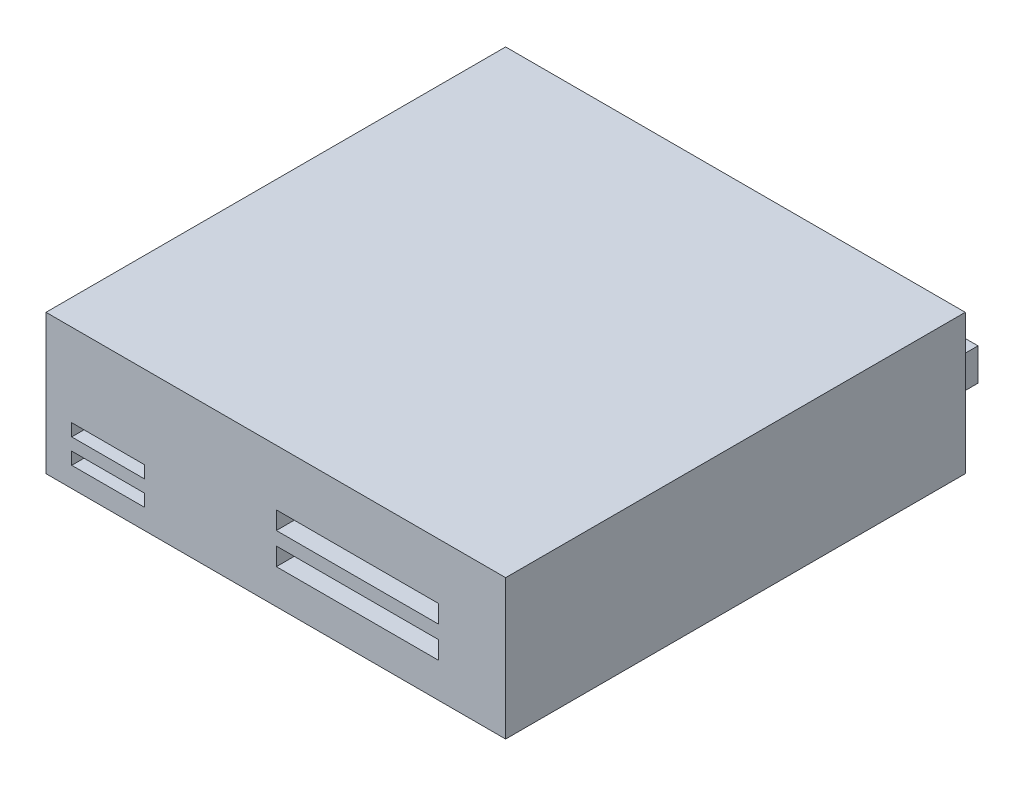
ISO-10303-21;
HEADER;
FILE_DESCRIPTION(('STEP AP214'),'2;1');
FILE_NAME('part.step','',(''),(''),'','','');
FILE_SCHEMA(('AUTOMOTIVE_DESIGN { 1 0 10303 214 1 1 1 1 }'));
ENDSEC;
DATA;
#1=APPLICATION_CONTEXT('core data for automotive mechanical design processes');
#2=APPLICATION_PROTOCOL_DEFINITION('international standard','automotive_design',2000,#1);
#3=PRODUCT_CONTEXT('',#1,'mechanical');
#4=PRODUCT('Part','Part','',(#3));
#5=PRODUCT_RELATED_PRODUCT_CATEGORY('part','',(#4));
#6=PRODUCT_DEFINITION_FORMATION('','',#4);
#7=PRODUCT_DEFINITION_CONTEXT('part definition',#1,'design');
#8=PRODUCT_DEFINITION('design','',#6,#7);
#9=PRODUCT_DEFINITION_SHAPE('','',#8);
#10=(LENGTH_UNIT() NAMED_UNIT(*) SI_UNIT(.MILLI.,.METRE.));
#11=(NAMED_UNIT(*) PLANE_ANGLE_UNIT() SI_UNIT($,.RADIAN.));
#12=(NAMED_UNIT(*) SI_UNIT($,.STERADIAN.) SOLID_ANGLE_UNIT());
#13=UNCERTAINTY_MEASURE_WITH_UNIT(LENGTH_MEASURE(1.E-05),#10,'distance_accuracy_value','');
#14=(GEOMETRIC_REPRESENTATION_CONTEXT(3) GLOBAL_UNCERTAINTY_ASSIGNED_CONTEXT((#13)) GLOBAL_UNIT_ASSIGNED_CONTEXT((#10,
#11,#12)) REPRESENTATION_CONTEXT('',''));
#15=CARTESIAN_POINT('',(0.,0.,0.));
#16=DIRECTION('',(0.,0.,1.));
#17=DIRECTION('',(1.,0.,0.));
#18=AXIS2_PLACEMENT_3D('',#15,#16,#17);
#19=CARTESIAN_POINT('',(-20.55,12.5,-20.55));
#20=DIRECTION('',(0.,0.,1.));
#21=DIRECTION('',(1.,0.,0.));
#22=AXIS2_PLACEMENT_3D('',#19,#20,#21);
#23=PLANE('',#22);
#24=DIRECTION('',(-1.,0.,0.));
#25=VECTOR('',#24,1.);
#26=CARTESIAN_POINT('',(-20.55,0.,-20.55));
#27=LINE('',#26,#25);
#28=CARTESIAN_POINT('',(20.55,0.,-20.55));
#29=VERTEX_POINT('',#28);
#30=CARTESIAN_POINT('',(-20.55,0.,-20.55));
#31=VERTEX_POINT('',#30);
#32=EDGE_CURVE('E456',#29,#31,#27,.T.);
#33=ORIENTED_EDGE('',*,*,#32,.T.);
#34=DIRECTION('',(0.,-1.,0.));
#35=VECTOR('',#34,1.);
#36=CARTESIAN_POINT('',(-20.55,12.5,-20.55));
#37=LINE('',#36,#35);
#38=CARTESIAN_POINT('',(-20.55,12.5,-20.55));
#39=VERTEX_POINT('',#38);
#40=EDGE_CURVE('E48',#39,#31,#37,.T.);
#41=ORIENTED_EDGE('',*,*,#40,.F.);
#42=DIRECTION('',(-1.,0.,0.));
#43=VECTOR('',#42,1.);
#44=CARTESIAN_POINT('',(-20.55,12.5,-20.55));
#45=LINE('',#44,#43);
#46=CARTESIAN_POINT('',(20.55,12.5,-20.55));
#47=VERTEX_POINT('',#46);
#48=EDGE_CURVE('E442',#47,#39,#45,.T.);
#49=ORIENTED_EDGE('',*,*,#48,.F.);
#50=DIRECTION('',(0.,-1.,0.));
#51=VECTOR('',#50,1.);
#52=CARTESIAN_POINT('',(20.55,12.5,-20.55));
#53=LINE('',#52,#51);
#54=EDGE_CURVE('E11',#47,#29,#53,.T.);
#55=ORIENTED_EDGE('',*,*,#54,.T.);
#56=EDGE_LOOP('',(#33,#41,#49,#55));
#57=FACE_BOUND('',#56,.T.);
#58=DIRECTION('',(0.,-1.,0.));
#59=VECTOR('',#58,1.);
#60=CARTESIAN_POINT('',(18.6891056004458,7.47226356728993,-20.55));
#61=LINE('',#60,#59);
#62=CARTESIAN_POINT('',(18.6891056004458,7.47226356728993,-20.55));
#63=VERTEX_POINT('',#62);
#64=CARTESIAN_POINT('',(18.6891056004458,4.57765461907273,-20.55));
#65=VERTEX_POINT('',#64);
#66=EDGE_CURVE('E260',#63,#65,#61,.T.);
#67=ORIENTED_EDGE('',*,*,#66,.F.);
#68=DIRECTION('',(1.,0.,0.));
#69=VECTOR('',#68,1.);
#70=CARTESIAN_POINT('',(18.6891056004458,7.47226356728993,-20.55));
#71=LINE('',#70,#69);
#72=CARTESIAN_POINT('',(10.3199101632091,7.47226356728993,-20.55));
#73=VERTEX_POINT('',#72);
#74=EDGE_CURVE('E257',#73,#63,#71,.T.);
#75=ORIENTED_EDGE('',*,*,#74,.F.);
#76=DIRECTION('',(0.,1.,0.));
#77=VECTOR('',#76,1.);
#78=CARTESIAN_POINT('',(10.3199101632091,7.47226356728993,-20.55));
#79=LINE('',#78,#77);
#80=CARTESIAN_POINT('',(10.3199101632091,4.57765461907273,-20.55));
#81=VERTEX_POINT('',#80);
#82=EDGE_CURVE('E66',#81,#73,#79,.T.);
#83=ORIENTED_EDGE('',*,*,#82,.F.);
#84=DIRECTION('',(-1.,0.,0.));
#85=VECTOR('',#84,1.);
#86=CARTESIAN_POINT('',(18.6891056004458,4.57765461907273,-20.55));
#87=LINE('',#86,#85);
#88=EDGE_CURVE('E58',#65,#81,#87,.T.);
#89=ORIENTED_EDGE('',*,*,#88,.F.);
#90=EDGE_LOOP('',(#67,#75,#83,#89));
#91=FACE_BOUND('',#90,.T.);
#92=ADVANCED_FACE('F39',(#57,#91),#23,.F.);
#93=CARTESIAN_POINT('',(20.55,12.5,20.55));
#94=DIRECTION('',(-1.,0.,0.));
#95=DIRECTION('',(0.,0.,1.));
#96=AXIS2_PLACEMENT_3D('',#93,#94,#95);
#97=PLANE('',#96);
#98=DIRECTION('',(0.,0.,-1.));
#99=VECTOR('',#98,1.);
#100=CARTESIAN_POINT('',(20.55,0.,20.55));
#101=LINE('',#100,#99);
#102=CARTESIAN_POINT('',(20.55,0.,20.55));
#103=VERTEX_POINT('',#102);
#104=EDGE_CURVE('E305',#103,#29,#101,.T.);
#105=ORIENTED_EDGE('',*,*,#104,.T.);
#106=ORIENTED_EDGE('',*,*,#54,.F.);
#107=DIRECTION('',(0.,0.,-1.));
#108=VECTOR('',#107,1.);
#109=CARTESIAN_POINT('',(20.55,12.5,20.55));
#110=LINE('',#109,#108);
#111=CARTESIAN_POINT('',(20.55,12.5,20.55));
#112=VERTEX_POINT('',#111);
#113=EDGE_CURVE('E438',#112,#47,#110,.T.);
#114=ORIENTED_EDGE('',*,*,#113,.F.);
#115=DIRECTION('',(0.,-1.,0.));
#116=VECTOR('',#115,1.);
#117=CARTESIAN_POINT('',(20.55,12.5,20.55));
#118=LINE('',#117,#116);
#119=EDGE_CURVE('E452',#112,#103,#118,.T.);
#120=ORIENTED_EDGE('',*,*,#119,.T.);
#121=EDGE_LOOP('',(#105,#106,#114,#120));
#122=FACE_BOUND('',#121,.T.);
#123=ADVANCED_FACE('F41',(#122),#97,.F.);
#124=CARTESIAN_POINT('',(-20.55,12.5,20.55));
#125=DIRECTION('',(1.,0.,0.));
#126=DIRECTION('',(0.,0.,-1.));
#127=AXIS2_PLACEMENT_3D('',#124,#125,#126);
#128=PLANE('',#127);
#129=DIRECTION('',(0.,0.,1.));
#130=VECTOR('',#129,1.);
#131=CARTESIAN_POINT('',(-20.55,0.,20.55));
#132=LINE('',#131,#130);
#133=CARTESIAN_POINT('',(-20.55,0.,20.55));
#134=VERTEX_POINT('',#133);
#135=EDGE_CURVE('E459',#31,#134,#132,.T.);
#136=ORIENTED_EDGE('',*,*,#135,.T.);
#137=DIRECTION('',(0.,-1.,0.));
#138=VECTOR('',#137,1.);
#139=CARTESIAN_POINT('',(-20.55,12.5,20.55));
#140=LINE('',#139,#138);
#141=CARTESIAN_POINT('',(-20.55,12.5,20.55));
#142=VERTEX_POINT('',#141);
#143=EDGE_CURVE('E466',#142,#134,#140,.T.);
#144=ORIENTED_EDGE('',*,*,#143,.F.);
#145=DIRECTION('',(0.,0.,1.));
#146=VECTOR('',#145,1.);
#147=CARTESIAN_POINT('',(-20.55,12.5,20.55));
#148=LINE('',#147,#146);
#149=EDGE_CURVE('E446',#39,#142,#148,.T.);
#150=ORIENTED_EDGE('',*,*,#149,.F.);
#151=ORIENTED_EDGE('',*,*,#40,.T.);
#152=EDGE_LOOP('',(#136,#144,#150,#151));
#153=FACE_BOUND('',#152,.T.);
#154=ADVANCED_FACE('F475',(#153),#128,.F.);
#155=CARTESIAN_POINT('',(-20.55,12.5,20.55));
#156=DIRECTION('',(0.,0.,-1.));
#157=DIRECTION('',(-1.,0.,0.));
#158=AXIS2_PLACEMENT_3D('',#155,#156,#157);
#159=PLANE('',#158);
#160=DIRECTION('',(1.,0.,0.));
#161=VECTOR('',#160,1.);
#162=CARTESIAN_POINT('',(0.0499999999999947,5.9,20.55));
#163=LINE('',#162,#161);
#164=CARTESIAN_POINT('',(0.0499999999999945,5.9,20.55));
#165=VERTEX_POINT('',#164);
#166=CARTESIAN_POINT('',(14.55,5.9,20.55));
#167=VERTEX_POINT('',#166);
#168=EDGE_CURVE('E293',#165,#167,#163,.T.);
#169=ORIENTED_EDGE('',*,*,#168,.F.);
#170=DIRECTION('',(0.,-1.,0.));
#171=VECTOR('',#170,1.);
#172=CARTESIAN_POINT('',(0.0499999999999945,7.5,20.55));
#173=LINE('',#172,#171);
#174=CARTESIAN_POINT('',(0.0499999999999945,7.5,20.55));
#175=VERTEX_POINT('',#174);
#176=EDGE_CURVE('E291',#175,#165,#173,.T.);
#177=ORIENTED_EDGE('',*,*,#176,.F.);
#178=DIRECTION('',(-1.,0.,0.));
#179=VECTOR('',#178,1.);
#180=CARTESIAN_POINT('',(0.0499999999999945,7.5,20.55));
#181=LINE('',#180,#179);
#182=CARTESIAN_POINT('',(14.55,7.5,20.55));
#183=VERTEX_POINT('',#182);
#184=EDGE_CURVE('E278',#183,#175,#181,.T.);
#185=ORIENTED_EDGE('',*,*,#184,.F.);
#186=DIRECTION('',(0.,1.,0.));
#187=VECTOR('',#186,1.);
#188=CARTESIAN_POINT('',(14.55,7.5,20.55));
#189=LINE('',#188,#187);
#190=EDGE_CURVE('E297',#167,#183,#189,.T.);
#191=ORIENTED_EDGE('',*,*,#190,.F.);
#192=EDGE_LOOP('',(#169,#177,#185,#191));
#193=FACE_BOUND('',#192,.T.);
#194=DIRECTION('',(1.,0.,0.));
#195=VECTOR('',#194,1.);
#196=CARTESIAN_POINT('',(0.049999999999995,3.1,20.55));
#197=LINE('',#196,#195);
#198=CARTESIAN_POINT('',(0.049999999999998,3.1,20.55));
#199=VERTEX_POINT('',#198);
#200=CARTESIAN_POINT('',(14.55,3.1,20.55));
#201=VERTEX_POINT('',#200);
#202=EDGE_CURVE('E335',#199,#201,#197,.T.);
#203=ORIENTED_EDGE('',*,*,#202,.F.);
#204=DIRECTION('',(0.,-1.,0.));
#205=VECTOR('',#204,1.);
#206=CARTESIAN_POINT('',(0.0499999999999948,4.7,20.55));
#207=LINE('',#206,#205);
#208=CARTESIAN_POINT('',(0.0499999999999948,4.7,20.55));
#209=VERTEX_POINT('',#208);
#210=EDGE_CURVE('E333',#209,#199,#207,.T.);
#211=ORIENTED_EDGE('',*,*,#210,.F.);
#212=DIRECTION('',(-1.,0.,0.));
#213=VECTOR('',#212,1.);
#214=CARTESIAN_POINT('',(0.0499999999999948,4.7,20.55));
#215=LINE('',#214,#213);
#216=CARTESIAN_POINT('',(14.55,4.7,20.55));
#217=VERTEX_POINT('',#216);
#218=EDGE_CURVE('E320',#217,#209,#215,.T.);
#219=ORIENTED_EDGE('',*,*,#218,.F.);
#220=DIRECTION('',(0.,1.,0.));
#221=VECTOR('',#220,1.);
#222=CARTESIAN_POINT('',(14.55,4.7,20.55));
#223=LINE('',#222,#221);
#224=EDGE_CURVE('E339',#201,#217,#223,.T.);
#225=ORIENTED_EDGE('',*,*,#224,.F.);
#226=EDGE_LOOP('',(#203,#211,#219,#225));
#227=FACE_BOUND('',#226,.T.);
#228=DIRECTION('',(1.,0.,0.));
#229=VECTOR('',#228,1.);
#230=CARTESIAN_POINT('',(-18.25,4.,20.55));
#231=LINE('',#230,#229);
#232=CARTESIAN_POINT('',(-18.25,4.,20.55));
#233=VERTEX_POINT('',#232);
#234=CARTESIAN_POINT('',(-11.75,4.,20.55));
#235=VERTEX_POINT('',#234);
#236=EDGE_CURVE('E376',#233,#235,#231,.T.);
#237=ORIENTED_EDGE('',*,*,#236,.F.);
#238=DIRECTION('',(0.,-1.,0.));
#239=VECTOR('',#238,1.);
#240=CARTESIAN_POINT('',(-18.25,5.1,20.55));
#241=LINE('',#240,#239);
#242=CARTESIAN_POINT('',(-18.25,5.1,20.55));
#243=VERTEX_POINT('',#242);
#244=EDGE_CURVE('E373',#243,#233,#241,.T.);
#245=ORIENTED_EDGE('',*,*,#244,.F.);
#246=DIRECTION('',(-1.,0.,0.));
#247=VECTOR('',#246,1.);
#248=CARTESIAN_POINT('',(-18.25,5.1,20.55));
#249=LINE('',#248,#247);
#250=CARTESIAN_POINT('',(-11.75,5.1,20.55));
#251=VERTEX_POINT('',#250);
#252=EDGE_CURVE('E360',#251,#243,#249,.T.);
#253=ORIENTED_EDGE('',*,*,#252,.F.);
#254=DIRECTION('',(0.,1.,0.));
#255=VECTOR('',#254,1.);
#256=CARTESIAN_POINT('',(-11.75,5.1,20.55));
#257=LINE('',#256,#255);
#258=EDGE_CURVE('E381',#235,#251,#257,.T.);
#259=ORIENTED_EDGE('',*,*,#258,.F.);
#260=EDGE_LOOP('',(#237,#245,#253,#259));
#261=FACE_BOUND('',#260,.T.);
#262=DIRECTION('',(1.,0.,0.));
#263=VECTOR('',#262,1.);
#264=CARTESIAN_POINT('',(-18.25,1.8,20.55));
#265=LINE('',#264,#263);
#266=CARTESIAN_POINT('',(-18.25,1.8,20.55));
#267=VERTEX_POINT('',#266);
#268=CARTESIAN_POINT('',(-11.75,1.8,20.55));
#269=VERTEX_POINT('',#268);
#270=EDGE_CURVE('E266',#267,#269,#265,.T.);
#271=ORIENTED_EDGE('',*,*,#270,.F.);
#272=DIRECTION('',(0.,-1.,0.));
#273=VECTOR('',#272,1.);
#274=CARTESIAN_POINT('',(-18.25,2.9,20.55));
#275=LINE('',#274,#273);
#276=CARTESIAN_POINT('',(-18.25,2.9,20.55));
#277=VERTEX_POINT('',#276);
#278=EDGE_CURVE('E262',#277,#267,#275,.T.);
#279=ORIENTED_EDGE('',*,*,#278,.F.);
#280=DIRECTION('',(-1.,0.,0.));
#281=VECTOR('',#280,1.);
#282=CARTESIAN_POINT('',(-18.25,2.9,20.55));
#283=LINE('',#282,#281);
#284=CARTESIAN_POINT('',(-11.75,2.9,20.55));
#285=VERTEX_POINT('',#284);
#286=EDGE_CURVE('E404',#285,#277,#283,.T.);
#287=ORIENTED_EDGE('',*,*,#286,.F.);
#288=DIRECTION('',(0.,1.,0.));
#289=VECTOR('',#288,1.);
#290=CARTESIAN_POINT('',(-11.75,2.9,20.55));
#291=LINE('',#290,#289);
#292=EDGE_CURVE('E420',#269,#285,#291,.T.);
#293=ORIENTED_EDGE('',*,*,#292,.F.);
#294=EDGE_LOOP('',(#271,#279,#287,#293));
#295=FACE_BOUND('',#294,.T.);
#296=DIRECTION('',(1.,0.,0.));
#297=VECTOR('',#296,1.);
#298=CARTESIAN_POINT('',(-20.55,0.,20.55));
#299=LINE('',#298,#297);
#300=EDGE_CURVE('E443',#134,#103,#299,.T.);
#301=ORIENTED_EDGE('',*,*,#300,.T.);
#302=ORIENTED_EDGE('',*,*,#119,.F.);
#303=DIRECTION('',(1.,0.,0.));
#304=VECTOR('',#303,1.);
#305=CARTESIAN_POINT('',(-20.55,12.5,20.55));
#306=LINE('',#305,#304);
#307=EDGE_CURVE('E449',#142,#112,#306,.T.);
#308=ORIENTED_EDGE('',*,*,#307,.F.);
#309=ORIENTED_EDGE('',*,*,#143,.T.);
#310=EDGE_LOOP('',(#301,#302,#308,#309));
#311=FACE_BOUND('',#310,.T.);
#312=ADVANCED_FACE('F484',(#193,#227,#261,#295,#311),#159,.F.);
#313=CARTESIAN_POINT('',(0.,12.5,0.));
#314=DIRECTION('',(0.,-1.,0.));
#315=DIRECTION('',(0.,0.,-1.));
#316=AXIS2_PLACEMENT_3D('',#313,#314,#315);
#317=PLANE('',#316);
#318=ORIENTED_EDGE('',*,*,#113,.T.);
#319=ORIENTED_EDGE('',*,*,#48,.T.);
#320=ORIENTED_EDGE('',*,*,#149,.T.);
#321=ORIENTED_EDGE('',*,*,#307,.T.);
#322=EDGE_LOOP('',(#318,#319,#320,#321));
#323=FACE_BOUND('',#322,.T.);
#324=ADVANCED_FACE('F490',(#323),#317,.F.);
#325=CARTESIAN_POINT('',(0.,0.,0.));
#326=DIRECTION('',(0.,-1.,0.));
#327=DIRECTION('',(0.,0.,-1.));
#328=AXIS2_PLACEMENT_3D('',#325,#326,#327);
#329=PLANE('',#328);
#330=ORIENTED_EDGE('',*,*,#104,.F.);
#331=ORIENTED_EDGE('',*,*,#300,.F.);
#332=ORIENTED_EDGE('',*,*,#135,.F.);
#333=ORIENTED_EDGE('',*,*,#32,.F.);
#334=EDGE_LOOP('',(#330,#331,#332,#333));
#335=FACE_BOUND('',#334,.T.);
#336=ADVANCED_FACE('F481',(#335),#329,.T.);
#337=CARTESIAN_POINT('',(-18.25,2.9,-9.44999999999999));
#338=DIRECTION('',(-1.,0.,0.));
#339=DIRECTION('',(0.,0.,1.));
#340=AXIS2_PLACEMENT_3D('',#337,#338,#339);
#341=PLANE('',#340);
#342=ORIENTED_EDGE('',*,*,#278,.T.);
#343=DIRECTION('',(0.,0.,1.));
#344=VECTOR('',#343,1.);
#345=CARTESIAN_POINT('',(-18.25,1.8,-9.44999999999999));
#346=LINE('',#345,#344);
#347=CARTESIAN_POINT('',(-18.25,1.8,-9.44999999999999));
#348=VERTEX_POINT('',#347);
#349=EDGE_CURVE('E415',#348,#267,#346,.T.);
#350=ORIENTED_EDGE('',*,*,#349,.F.);
#351=DIRECTION('',(0.,-1.,0.));
#352=VECTOR('',#351,1.);
#353=CARTESIAN_POINT('',(-18.25,2.9,-9.44999999999999));
#354=LINE('',#353,#352);
#355=CARTESIAN_POINT('',(-18.25,2.9,-9.44999999999999));
#356=VERTEX_POINT('',#355);
#357=EDGE_CURVE('E399',#356,#348,#354,.T.);
#358=ORIENTED_EDGE('',*,*,#357,.F.);
#359=DIRECTION('',(0.,0.,1.));
#360=VECTOR('',#359,1.);
#361=CARTESIAN_POINT('',(-18.25,2.9,-9.44999999999999));
#362=LINE('',#361,#360);
#363=EDGE_CURVE('E377',#356,#277,#362,.T.);
#364=ORIENTED_EDGE('',*,*,#363,.T.);
#365=EDGE_LOOP('',(#342,#350,#358,#364));
#366=FACE_BOUND('',#365,.T.);
#367=ADVANCED_FACE('F595',(#366),#341,.F.);
#368=CARTESIAN_POINT('',(-18.25,2.9,-9.44999999999999));
#369=DIRECTION('',(0.,1.,0.));
#370=DIRECTION('',(0.,0.,1.));
#371=AXIS2_PLACEMENT_3D('',#368,#369,#370);
#372=PLANE('',#371);
#373=ORIENTED_EDGE('',*,*,#286,.T.);
#374=ORIENTED_EDGE('',*,*,#363,.F.);
#375=DIRECTION('',(-1.,0.,0.));
#376=VECTOR('',#375,1.);
#377=CARTESIAN_POINT('',(-18.25,2.9,-9.44999999999999));
#378=LINE('',#377,#376);
#379=CARTESIAN_POINT('',(-11.75,2.9,-9.44999999999999));
#380=VERTEX_POINT('',#379);
#381=EDGE_CURVE('E412',#380,#356,#378,.T.);
#382=ORIENTED_EDGE('',*,*,#381,.F.);
#383=DIRECTION('',(0.,0.,1.));
#384=VECTOR('',#383,1.);
#385=CARTESIAN_POINT('',(-11.75,2.9,-9.44999999999999));
#386=LINE('',#385,#384);
#387=EDGE_CURVE('E429',#380,#285,#386,.T.);
#388=ORIENTED_EDGE('',*,*,#387,.T.);
#389=EDGE_LOOP('',(#373,#374,#382,#388));
#390=FACE_BOUND('',#389,.T.);
#391=ADVANCED_FACE('F591',(#390),#372,.F.);
#392=CARTESIAN_POINT('',(-11.75,2.9,-9.44999999999999));
#393=DIRECTION('',(1.,0.,0.));
#394=DIRECTION('',(0.,0.,-1.));
#395=AXIS2_PLACEMENT_3D('',#392,#393,#394);
#396=PLANE('',#395);
#397=ORIENTED_EDGE('',*,*,#292,.T.);
#398=ORIENTED_EDGE('',*,*,#387,.F.);
#399=DIRECTION('',(0.,1.,0.));
#400=VECTOR('',#399,1.);
#401=CARTESIAN_POINT('',(-11.75,2.9,-9.44999999999999));
#402=LINE('',#401,#400);
#403=CARTESIAN_POINT('',(-11.75,1.8,-9.44999999999999));
#404=VERTEX_POINT('',#403);
#405=EDGE_CURVE('E408',#404,#380,#402,.T.);
#406=ORIENTED_EDGE('',*,*,#405,.F.);
#407=DIRECTION('',(0.,0.,1.));
#408=VECTOR('',#407,1.);
#409=CARTESIAN_POINT('',(-11.75,1.8,-9.44999999999999));
#410=LINE('',#409,#408);
#411=EDGE_CURVE('E432',#404,#269,#410,.T.);
#412=ORIENTED_EDGE('',*,*,#411,.T.);
#413=EDGE_LOOP('',(#397,#398,#406,#412));
#414=FACE_BOUND('',#413,.T.);
#415=ADVANCED_FACE('F594',(#414),#396,.F.);
#416=CARTESIAN_POINT('',(-18.25,1.8,-9.44999999999999));
#417=DIRECTION('',(0.,-1.,0.));
#418=DIRECTION('',(0.,0.,-1.));
#419=AXIS2_PLACEMENT_3D('',#416,#417,#418);
#420=PLANE('',#419);
#421=ORIENTED_EDGE('',*,*,#270,.T.);
#422=ORIENTED_EDGE('',*,*,#411,.F.);
#423=DIRECTION('',(1.,0.,0.));
#424=VECTOR('',#423,1.);
#425=CARTESIAN_POINT('',(-18.25,1.8,-9.44999999999999));
#426=LINE('',#425,#424);
#427=EDGE_CURVE('E403',#348,#404,#426,.T.);
#428=ORIENTED_EDGE('',*,*,#427,.F.);
#429=ORIENTED_EDGE('',*,*,#349,.T.);
#430=EDGE_LOOP('',(#421,#422,#428,#429));
#431=FACE_BOUND('',#430,.T.);
#432=ADVANCED_FACE('F589',(#431),#420,.F.);
#433=CARTESIAN_POINT('',(0.,0.,-9.44999999999999));
#434=DIRECTION('',(0.,0.,1.));
#435=DIRECTION('',(1.,0.,0.));
#436=AXIS2_PLACEMENT_3D('',#433,#434,#435);
#437=PLANE('',#436);
#438=ORIENTED_EDGE('',*,*,#357,.T.);
#439=ORIENTED_EDGE('',*,*,#427,.T.);
#440=ORIENTED_EDGE('',*,*,#405,.T.);
#441=ORIENTED_EDGE('',*,*,#381,.T.);
#442=EDGE_LOOP('',(#438,#439,#440,#441));
#443=FACE_BOUND('',#442,.T.);
#444=ADVANCED_FACE('F585',(#443),#437,.T.);
#445=CARTESIAN_POINT('',(-18.25,5.1,-9.44999999999999));
#446=DIRECTION('',(-1.,0.,0.));
#447=DIRECTION('',(0.,0.,1.));
#448=AXIS2_PLACEMENT_3D('',#445,#446,#447);
#449=PLANE('',#448);
#450=ORIENTED_EDGE('',*,*,#244,.T.);
#451=DIRECTION('',(0.,0.,1.));
#452=VECTOR('',#451,1.);
#453=CARTESIAN_POINT('',(-18.25,4.,-9.44999999999999));
#454=LINE('',#453,#452);
#455=CARTESIAN_POINT('',(-18.25,4.,-9.44999999999999));
#456=VERTEX_POINT('',#455);
#457=EDGE_CURVE('E372',#456,#233,#454,.T.);
#458=ORIENTED_EDGE('',*,*,#457,.F.);
#459=DIRECTION('',(0.,-1.,0.));
#460=VECTOR('',#459,1.);
#461=CARTESIAN_POINT('',(-18.25,5.1,-9.44999999999999));
#462=LINE('',#461,#460);
#463=CARTESIAN_POINT('',(-18.25,5.1,-9.44999999999999));
#464=VERTEX_POINT('',#463);
#465=EDGE_CURVE('E355',#464,#456,#462,.T.);
#466=ORIENTED_EDGE('',*,*,#465,.F.);
#467=DIRECTION('',(0.,0.,1.));
#468=VECTOR('',#467,1.);
#469=CARTESIAN_POINT('',(-18.25,5.1,-9.44999999999999));
#470=LINE('',#469,#468);
#471=EDGE_CURVE('E336',#464,#243,#470,.T.);
#472=ORIENTED_EDGE('',*,*,#471,.T.);
#473=EDGE_LOOP('',(#450,#458,#466,#472));
#474=FACE_BOUND('',#473,.T.);
#475=ADVANCED_FACE('F575',(#474),#449,.F.);
#476=CARTESIAN_POINT('',(-18.25,5.1,-9.44999999999999));
#477=DIRECTION('',(0.,1.,0.));
#478=DIRECTION('',(0.,0.,1.));
#479=AXIS2_PLACEMENT_3D('',#476,#477,#478);
#480=PLANE('',#479);
#481=ORIENTED_EDGE('',*,*,#252,.T.);
#482=ORIENTED_EDGE('',*,*,#471,.F.);
#483=DIRECTION('',(-1.,0.,0.));
#484=VECTOR('',#483,1.);
#485=CARTESIAN_POINT('',(-18.25,5.1,-9.44999999999999));
#486=LINE('',#485,#484);
#487=CARTESIAN_POINT('',(-11.75,5.1,-9.44999999999999));
#488=VERTEX_POINT('',#487);
#489=EDGE_CURVE('E368',#488,#464,#486,.T.);
#490=ORIENTED_EDGE('',*,*,#489,.F.);
#491=DIRECTION('',(0.,0.,1.));
#492=VECTOR('',#491,1.);
#493=CARTESIAN_POINT('',(-11.75,5.1,-9.44999999999999));
#494=LINE('',#493,#492);
#495=EDGE_CURVE('E390',#488,#251,#494,.T.);
#496=ORIENTED_EDGE('',*,*,#495,.T.);
#497=EDGE_LOOP('',(#481,#482,#490,#496));
#498=FACE_BOUND('',#497,.T.);
#499=ADVANCED_FACE('F571',(#498),#480,.F.);
#500=CARTESIAN_POINT('',(-11.75,5.1,-9.44999999999999));
#501=DIRECTION('',(1.,0.,0.));
#502=DIRECTION('',(0.,0.,-1.));
#503=AXIS2_PLACEMENT_3D('',#500,#501,#502);
#504=PLANE('',#503);
#505=ORIENTED_EDGE('',*,*,#258,.T.);
#506=ORIENTED_EDGE('',*,*,#495,.F.);
#507=DIRECTION('',(0.,1.,0.));
#508=VECTOR('',#507,1.);
#509=CARTESIAN_POINT('',(-11.75,5.1,-9.44999999999999));
#510=LINE('',#509,#508);
#511=CARTESIAN_POINT('',(-11.75,4.,-9.44999999999999));
#512=VERTEX_POINT('',#511);
#513=EDGE_CURVE('E364',#512,#488,#510,.T.);
#514=ORIENTED_EDGE('',*,*,#513,.F.);
#515=DIRECTION('',(0.,0.,1.));
#516=VECTOR('',#515,1.);
#517=CARTESIAN_POINT('',(-11.75,4.,-9.44999999999999));
#518=LINE('',#517,#516);
#519=EDGE_CURVE('E393',#512,#235,#518,.T.);
#520=ORIENTED_EDGE('',*,*,#519,.T.);
#521=EDGE_LOOP('',(#505,#506,#514,#520));
#522=FACE_BOUND('',#521,.T.);
#523=ADVANCED_FACE('F574',(#522),#504,.F.);
#524=CARTESIAN_POINT('',(-18.25,4.,-9.44999999999999));
#525=DIRECTION('',(0.,-1.,0.));
#526=DIRECTION('',(0.,0.,-1.));
#527=AXIS2_PLACEMENT_3D('',#524,#525,#526);
#528=PLANE('',#527);
#529=ORIENTED_EDGE('',*,*,#236,.T.);
#530=ORIENTED_EDGE('',*,*,#519,.F.);
#531=DIRECTION('',(1.,0.,0.));
#532=VECTOR('',#531,1.);
#533=CARTESIAN_POINT('',(-18.25,4.,-9.44999999999999));
#534=LINE('',#533,#532);
#535=EDGE_CURVE('E359',#456,#512,#534,.T.);
#536=ORIENTED_EDGE('',*,*,#535,.F.);
#537=ORIENTED_EDGE('',*,*,#457,.T.);
#538=EDGE_LOOP('',(#529,#530,#536,#537));
#539=FACE_BOUND('',#538,.T.);
#540=ADVANCED_FACE('F569',(#539),#528,.F.);
#541=CARTESIAN_POINT('',(0.,0.,-9.44999999999999));
#542=DIRECTION('',(0.,0.,1.));
#543=DIRECTION('',(1.,0.,0.));
#544=AXIS2_PLACEMENT_3D('',#541,#542,#543);
#545=PLANE('',#544);
#546=ORIENTED_EDGE('',*,*,#465,.T.);
#547=ORIENTED_EDGE('',*,*,#535,.T.);
#548=ORIENTED_EDGE('',*,*,#513,.T.);
#549=ORIENTED_EDGE('',*,*,#489,.T.);
#550=EDGE_LOOP('',(#546,#547,#548,#549));
#551=FACE_BOUND('',#550,.T.);
#552=ADVANCED_FACE('F565',(#551),#545,.T.);
#553=CARTESIAN_POINT('',(0.0499999999999948,4.7,-9.44999999999999));
#554=DIRECTION('',(-1.,0.,0.));
#555=DIRECTION('',(0.,-1.,0.));
#556=AXIS2_PLACEMENT_3D('',#553,#554,#555);
#557=PLANE('',#556);
#558=ORIENTED_EDGE('',*,*,#210,.T.);
#559=DIRECTION('',(0.,0.,1.));
#560=VECTOR('',#559,1.);
#561=CARTESIAN_POINT('',(0.049999999999995,3.1,-9.44999999999999));
#562=LINE('',#561,#560);
#563=CARTESIAN_POINT('',(0.049999999999995,3.1,-9.44999999999999));
#564=VERTEX_POINT('',#563);
#565=EDGE_CURVE('E332',#564,#199,#562,.T.);
#566=ORIENTED_EDGE('',*,*,#565,.F.);
#567=DIRECTION('',(0.,-1.,0.));
#568=VECTOR('',#567,1.);
#569=CARTESIAN_POINT('',(0.0499999999999948,4.7,-9.44999999999999));
#570=LINE('',#569,#568);
#571=CARTESIAN_POINT('',(0.0499999999999948,4.7,-9.44999999999999));
#572=VERTEX_POINT('',#571);
#573=EDGE_CURVE('E315',#572,#564,#570,.T.);
#574=ORIENTED_EDGE('',*,*,#573,.F.);
#575=DIRECTION('',(0.,0.,1.));
#576=VECTOR('',#575,1.);
#577=CARTESIAN_POINT('',(0.0499999999999948,4.7,-9.44999999999999));
#578=LINE('',#577,#576);
#579=EDGE_CURVE('E294',#572,#209,#578,.T.);
#580=ORIENTED_EDGE('',*,*,#579,.T.);
#581=EDGE_LOOP('',(#558,#566,#574,#580));
#582=FACE_BOUND('',#581,.T.);
#583=ADVANCED_FACE('F555',(#582),#557,.F.);
#584=CARTESIAN_POINT('',(0.0499999999999948,4.7,-9.44999999999999));
#585=DIRECTION('',(0.,1.,0.));
#586=DIRECTION('',(0.,0.,1.));
#587=AXIS2_PLACEMENT_3D('',#584,#585,#586);
#588=PLANE('',#587);
#589=ORIENTED_EDGE('',*,*,#218,.T.);
#590=ORIENTED_EDGE('',*,*,#579,.F.);
#591=DIRECTION('',(-1.,0.,0.));
#592=VECTOR('',#591,1.);
#593=CARTESIAN_POINT('',(0.0499999999999948,4.7,-9.44999999999999));
#594=LINE('',#593,#592);
#595=CARTESIAN_POINT('',(14.55,4.7,-9.44999999999999));
#596=VERTEX_POINT('',#595);
#597=EDGE_CURVE('E328',#596,#572,#594,.T.);
#598=ORIENTED_EDGE('',*,*,#597,.F.);
#599=DIRECTION('',(0.,0.,1.));
#600=VECTOR('',#599,1.);
#601=CARTESIAN_POINT('',(14.55,4.7,-9.44999999999999));
#602=LINE('',#601,#600);
#603=EDGE_CURVE('E346',#596,#217,#602,.T.);
#604=ORIENTED_EDGE('',*,*,#603,.T.);
#605=EDGE_LOOP('',(#589,#590,#598,#604));
#606=FACE_BOUND('',#605,.T.);
#607=ADVANCED_FACE('F551',(#606),#588,.F.);
#608=CARTESIAN_POINT('',(14.55,4.7,-9.44999999999999));
#609=DIRECTION('',(1.,0.,0.));
#610=DIRECTION('',(0.,0.,-1.));
#611=AXIS2_PLACEMENT_3D('',#608,#609,#610);
#612=PLANE('',#611);
#613=ORIENTED_EDGE('',*,*,#224,.T.);
#614=ORIENTED_EDGE('',*,*,#603,.F.);
#615=DIRECTION('',(0.,1.,0.));
#616=VECTOR('',#615,1.);
#617=CARTESIAN_POINT('',(14.55,4.7,-9.44999999999999));
#618=LINE('',#617,#616);
#619=CARTESIAN_POINT('',(14.55,3.1,-9.44999999999999));
#620=VERTEX_POINT('',#619);
#621=EDGE_CURVE('E324',#620,#596,#618,.T.);
#622=ORIENTED_EDGE('',*,*,#621,.F.);
#623=DIRECTION('',(0.,0.,1.));
#624=VECTOR('',#623,1.);
#625=CARTESIAN_POINT('',(14.55,3.1,-9.44999999999999));
#626=LINE('',#625,#624);
#627=EDGE_CURVE('E349',#620,#201,#626,.T.);
#628=ORIENTED_EDGE('',*,*,#627,.T.);
#629=EDGE_LOOP('',(#613,#614,#622,#628));
#630=FACE_BOUND('',#629,.T.);
#631=ADVANCED_FACE('F554',(#630),#612,.F.);
#632=CARTESIAN_POINT('',(0.049999999999995,3.1,-9.44999999999999));
#633=DIRECTION('',(0.,-1.,0.));
#634=DIRECTION('',(0.,0.,-1.));
#635=AXIS2_PLACEMENT_3D('',#632,#633,#634);
#636=PLANE('',#635);
#637=ORIENTED_EDGE('',*,*,#202,.T.);
#638=ORIENTED_EDGE('',*,*,#627,.F.);
#639=DIRECTION('',(1.,0.,0.));
#640=VECTOR('',#639,1.);
#641=CARTESIAN_POINT('',(0.049999999999995,3.1,-9.44999999999999));
#642=LINE('',#641,#640);
#643=EDGE_CURVE('E319',#564,#620,#642,.T.);
#644=ORIENTED_EDGE('',*,*,#643,.F.);
#645=ORIENTED_EDGE('',*,*,#565,.T.);
#646=EDGE_LOOP('',(#637,#638,#644,#645));
#647=FACE_BOUND('',#646,.T.);
#648=ADVANCED_FACE('F549',(#647),#636,.F.);
#649=CARTESIAN_POINT('',(0.,0.,-9.44999999999999));
#650=DIRECTION('',(0.,0.,1.));
#651=DIRECTION('',(1.,0.,0.));
#652=AXIS2_PLACEMENT_3D('',#649,#650,#651);
#653=PLANE('',#652);
#654=ORIENTED_EDGE('',*,*,#573,.T.);
#655=ORIENTED_EDGE('',*,*,#643,.T.);
#656=ORIENTED_EDGE('',*,*,#621,.T.);
#657=ORIENTED_EDGE('',*,*,#597,.T.);
#658=EDGE_LOOP('',(#654,#655,#656,#657));
#659=FACE_BOUND('',#658,.T.);
#660=ADVANCED_FACE('F545',(#659),#653,.T.);
#661=CARTESIAN_POINT('',(0.0499999999999945,7.5,-9.44999999999999));
#662=DIRECTION('',(-1.,0.,0.));
#663=DIRECTION('',(0.,-1.,0.));
#664=AXIS2_PLACEMENT_3D('',#661,#662,#663);
#665=PLANE('',#664);
#666=ORIENTED_EDGE('',*,*,#176,.T.);
#667=DIRECTION('',(0.,0.,1.));
#668=VECTOR('',#667,1.);
#669=CARTESIAN_POINT('',(0.0499999999999947,5.9,-9.44999999999999));
#670=LINE('',#669,#668);
#671=CARTESIAN_POINT('',(0.0499999999999947,5.9,-9.44999999999999));
#672=VERTEX_POINT('',#671);
#673=EDGE_CURVE('E290',#672,#165,#670,.T.);
#674=ORIENTED_EDGE('',*,*,#673,.F.);
#675=DIRECTION('',(0.,-1.,0.));
#676=VECTOR('',#675,1.);
#677=CARTESIAN_POINT('',(0.0499999999999945,7.5,-9.44999999999999));
#678=LINE('',#677,#676);
#679=CARTESIAN_POINT('',(0.0499999999999945,7.5,-9.44999999999999));
#680=VERTEX_POINT('',#679);
#681=EDGE_CURVE('E273',#680,#672,#678,.T.);
#682=ORIENTED_EDGE('',*,*,#681,.F.);
#683=DIRECTION('',(0.,0.,1.));
#684=VECTOR('',#683,1.);
#685=CARTESIAN_POINT('',(0.0499999999999945,7.5,-9.44999999999999));
#686=LINE('',#685,#684);
#687=EDGE_CURVE('E302',#680,#175,#686,.T.);
#688=ORIENTED_EDGE('',*,*,#687,.T.);
#689=EDGE_LOOP('',(#666,#674,#682,#688));
#690=FACE_BOUND('',#689,.T.);
#691=ADVANCED_FACE('F535',(#690),#665,.F.);
#692=CARTESIAN_POINT('',(0.0499999999999945,7.5,-9.44999999999999));
#693=DIRECTION('',(0.,1.,0.));
#694=DIRECTION('',(0.,0.,1.));
#695=AXIS2_PLACEMENT_3D('',#692,#693,#694);
#696=PLANE('',#695);
#697=ORIENTED_EDGE('',*,*,#184,.T.);
#698=ORIENTED_EDGE('',*,*,#687,.F.);
#699=DIRECTION('',(-1.,0.,0.));
#700=VECTOR('',#699,1.);
#701=CARTESIAN_POINT('',(0.0499999999999945,7.5,-9.44999999999999));
#702=LINE('',#701,#700);
#703=CARTESIAN_POINT('',(14.55,7.5,-9.44999999999999));
#704=VERTEX_POINT('',#703);
#705=EDGE_CURVE('E286',#704,#680,#702,.T.);
#706=ORIENTED_EDGE('',*,*,#705,.F.);
#707=DIRECTION('',(0.,0.,1.));
#708=VECTOR('',#707,1.);
#709=CARTESIAN_POINT('',(14.55,7.5,-9.44999999999999));
#710=LINE('',#709,#708);
#711=EDGE_CURVE('E306',#704,#183,#710,.T.);
#712=ORIENTED_EDGE('',*,*,#711,.T.);
#713=EDGE_LOOP('',(#697,#698,#706,#712));
#714=FACE_BOUND('',#713,.T.);
#715=ADVANCED_FACE('F531',(#714),#696,.F.);
#716=CARTESIAN_POINT('',(14.55,7.5,-9.44999999999999));
#717=DIRECTION('',(1.,0.,0.));
#718=DIRECTION('',(0.,0.,-1.));
#719=AXIS2_PLACEMENT_3D('',#716,#717,#718);
#720=PLANE('',#719);
#721=ORIENTED_EDGE('',*,*,#190,.T.);
#722=ORIENTED_EDGE('',*,*,#711,.F.);
#723=DIRECTION('',(0.,1.,0.));
#724=VECTOR('',#723,1.);
#725=CARTESIAN_POINT('',(14.55,7.5,-9.44999999999999));
#726=LINE('',#725,#724);
#727=CARTESIAN_POINT('',(14.55,5.9,-9.44999999999999));
#728=VERTEX_POINT('',#727);
#729=EDGE_CURVE('E282',#728,#704,#726,.T.);
#730=ORIENTED_EDGE('',*,*,#729,.F.);
#731=DIRECTION('',(0.,0.,1.));
#732=VECTOR('',#731,1.);
#733=CARTESIAN_POINT('',(14.55,5.9,-9.44999999999999));
#734=LINE('',#733,#732);
#735=EDGE_CURVE('E309',#728,#167,#734,.T.);
#736=ORIENTED_EDGE('',*,*,#735,.T.);
#737=EDGE_LOOP('',(#721,#722,#730,#736));
#738=FACE_BOUND('',#737,.T.);
#739=ADVANCED_FACE('F534',(#738),#720,.F.);
#740=CARTESIAN_POINT('',(0.0499999999999947,5.9,-9.44999999999999));
#741=DIRECTION('',(0.,-1.,0.));
#742=DIRECTION('',(0.,0.,-1.));
#743=AXIS2_PLACEMENT_3D('',#740,#741,#742);
#744=PLANE('',#743);
#745=ORIENTED_EDGE('',*,*,#168,.T.);
#746=ORIENTED_EDGE('',*,*,#735,.F.);
#747=DIRECTION('',(1.,0.,0.));
#748=VECTOR('',#747,1.);
#749=CARTESIAN_POINT('',(0.0499999999999947,5.9,-9.44999999999999));
#750=LINE('',#749,#748);
#751=EDGE_CURVE('E277',#672,#728,#750,.T.);
#752=ORIENTED_EDGE('',*,*,#751,.F.);
#753=ORIENTED_EDGE('',*,*,#673,.T.);
#754=EDGE_LOOP('',(#745,#746,#752,#753));
#755=FACE_BOUND('',#754,.T.);
#756=ADVANCED_FACE('F529',(#755),#744,.F.);
#757=CARTESIAN_POINT('',(0.,0.,-9.44999999999999));
#758=DIRECTION('',(0.,0.,1.));
#759=DIRECTION('',(1.,0.,0.));
#760=AXIS2_PLACEMENT_3D('',#757,#758,#759);
#761=PLANE('',#760);
#762=ORIENTED_EDGE('',*,*,#681,.T.);
#763=ORIENTED_EDGE('',*,*,#751,.T.);
#764=ORIENTED_EDGE('',*,*,#729,.T.);
#765=ORIENTED_EDGE('',*,*,#705,.T.);
#766=EDGE_LOOP('',(#762,#763,#764,#765));
#767=FACE_BOUND('',#766,.T.);
#768=ADVANCED_FACE('F526',(#767),#761,.T.);
#769=CARTESIAN_POINT('',(18.6891056004458,7.47226356728993,-23.55));
#770=DIRECTION('',(-1.,0.,0.));
#771=DIRECTION('',(0.,0.,1.));
#772=AXIS2_PLACEMENT_3D('',#769,#770,#771);
#773=PLANE('',#772);
#774=ORIENTED_EDGE('',*,*,#66,.T.);
#775=DIRECTION('',(0.,0.,1.));
#776=VECTOR('',#775,1.);
#777=CARTESIAN_POINT('',(18.6891056004458,4.57765461907273,-23.55));
#778=LINE('',#777,#776);
#779=CARTESIAN_POINT('',(18.6891056004458,4.57765461907273,-23.55));
#780=VERTEX_POINT('',#779);
#781=EDGE_CURVE('E239',#780,#65,#778,.T.);
#782=ORIENTED_EDGE('',*,*,#781,.F.);
#783=DIRECTION('',(0.,-1.,0.));
#784=VECTOR('',#783,1.);
#785=CARTESIAN_POINT('',(18.6891056004458,7.47226356728993,-23.55));
#786=LINE('',#785,#784);
#787=CARTESIAN_POINT('',(18.6891056004458,7.47226356728993,-23.55));
#788=VERTEX_POINT('',#787);
#789=EDGE_CURVE('E247',#788,#780,#786,.T.);
#790=ORIENTED_EDGE('',*,*,#789,.F.);
#791=DIRECTION('',(0.,0.,1.));
#792=VECTOR('',#791,1.);
#793=CARTESIAN_POINT('',(18.6891056004458,7.47226356728993,-23.55));
#794=LINE('',#793,#792);
#795=EDGE_CURVE('E498',#788,#63,#794,.T.);
#796=ORIENTED_EDGE('',*,*,#795,.T.);
#797=EDGE_LOOP('',(#774,#782,#790,#796));
#798=FACE_BOUND('',#797,.T.);
#799=ADVANCED_FACE('F259',(#798),#773,.F.);
#800=CARTESIAN_POINT('',(18.6891056004458,4.57765461907273,-23.55));
#801=DIRECTION('',(0.,1.,0.));
#802=DIRECTION('',(0.,0.,1.));
#803=AXIS2_PLACEMENT_3D('',#800,#801,#802);
#804=PLANE('',#803);
#805=ORIENTED_EDGE('',*,*,#88,.T.);
#806=DIRECTION('',(0.,0.,1.));
#807=VECTOR('',#806,1.);
#808=CARTESIAN_POINT('',(10.3199101632091,4.57765461907273,-23.55));
#809=LINE('',#808,#807);
#810=CARTESIAN_POINT('',(10.3199101632091,4.57765461907273,-23.55));
#811=VERTEX_POINT('',#810);
#812=EDGE_CURVE('E242',#811,#81,#809,.T.);
#813=ORIENTED_EDGE('',*,*,#812,.F.);
#814=DIRECTION('',(-1.,0.,0.));
#815=VECTOR('',#814,1.);
#816=CARTESIAN_POINT('',(18.6891056004458,4.57765461907273,-23.55));
#817=LINE('',#816,#815);
#818=EDGE_CURVE('E235',#780,#811,#817,.T.);
#819=ORIENTED_EDGE('',*,*,#818,.F.);
#820=ORIENTED_EDGE('',*,*,#781,.T.);
#821=EDGE_LOOP('',(#805,#813,#819,#820));
#822=FACE_BOUND('',#821,.T.);
#823=ADVANCED_FACE('F237',(#822),#804,.F.);
#824=CARTESIAN_POINT('',(10.3199101632091,7.47226356728993,-23.55));
#825=DIRECTION('',(1.,0.,0.));
#826=DIRECTION('',(0.,0.,-1.));
#827=AXIS2_PLACEMENT_3D('',#824,#825,#826);
#828=PLANE('',#827);
#829=ORIENTED_EDGE('',*,*,#82,.T.);
#830=DIRECTION('',(0.,0.,1.));
#831=VECTOR('',#830,1.);
#832=CARTESIAN_POINT('',(10.3199101632091,7.47226356728993,-23.55));
#833=LINE('',#832,#831);
#834=CARTESIAN_POINT('',(10.3199101632091,7.47226356728993,-23.55));
#835=VERTEX_POINT('',#834);
#836=EDGE_CURVE('E269',#835,#73,#833,.T.);
#837=ORIENTED_EDGE('',*,*,#836,.F.);
#838=DIRECTION('',(0.,1.,0.));
#839=VECTOR('',#838,1.);
#840=CARTESIAN_POINT('',(10.3199101632091,7.47226356728993,-23.55));
#841=LINE('',#840,#839);
#842=EDGE_CURVE('E246',#811,#835,#841,.T.);
#843=ORIENTED_EDGE('',*,*,#842,.F.);
#844=ORIENTED_EDGE('',*,*,#812,.T.);
#845=EDGE_LOOP('',(#829,#837,#843,#844));
#846=FACE_BOUND('',#845,.T.);
#847=ADVANCED_FACE('F513',(#846),#828,.F.);
#848=CARTESIAN_POINT('',(18.6891056004458,7.47226356728993,-23.55));
#849=DIRECTION('',(0.,-1.,0.));
#850=DIRECTION('',(0.,0.,-1.));
#851=AXIS2_PLACEMENT_3D('',#848,#849,#850);
#852=PLANE('',#851);
#853=ORIENTED_EDGE('',*,*,#74,.T.);
#854=ORIENTED_EDGE('',*,*,#795,.F.);
#855=DIRECTION('',(1.,0.,0.));
#856=VECTOR('',#855,1.);
#857=CARTESIAN_POINT('',(18.6891056004458,7.47226356728993,-23.55));
#858=LINE('',#857,#856);
#859=EDGE_CURVE('E252',#835,#788,#858,.T.);
#860=ORIENTED_EDGE('',*,*,#859,.F.);
#861=ORIENTED_EDGE('',*,*,#836,.T.);
#862=EDGE_LOOP('',(#853,#854,#860,#861));
#863=FACE_BOUND('',#862,.T.);
#864=ADVANCED_FACE('F497',(#863),#852,.F.);
#865=CARTESIAN_POINT('',(0.,0.,-23.55));
#866=DIRECTION('',(0.,0.,-1.));
#867=DIRECTION('',(-1.,0.,0.));
#868=AXIS2_PLACEMENT_3D('',#865,#866,#867);
#869=PLANE('',#868);
#870=ORIENTED_EDGE('',*,*,#789,.T.);
#871=ORIENTED_EDGE('',*,*,#818,.T.);
#872=ORIENTED_EDGE('',*,*,#842,.T.);
#873=ORIENTED_EDGE('',*,*,#859,.T.);
#874=EDGE_LOOP('',(#870,#871,#872,#873));
#875=FACE_BOUND('',#874,.T.);
#876=ADVANCED_FACE('F250',(#875),#869,.T.);
#877=CLOSED_SHELL('',(#92,#123,#154,#312,#324,#336,#367,#391,#415,#432,#444,#475,#499,#523,#540,
#552,#583,#607,#631,#648,#660,#691,#715,#739,#756,#768,#799,#823,#847,#864,#876));
#878=MANIFOLD_SOLID_BREP('B2',#877);
#879=ADVANCED_BREP_SHAPE_REPRESENTATION('',(#18,#878),#14);
#880=SHAPE_DEFINITION_REPRESENTATION(#9,#879);
ENDSEC;
END-ISO-10303-21;
